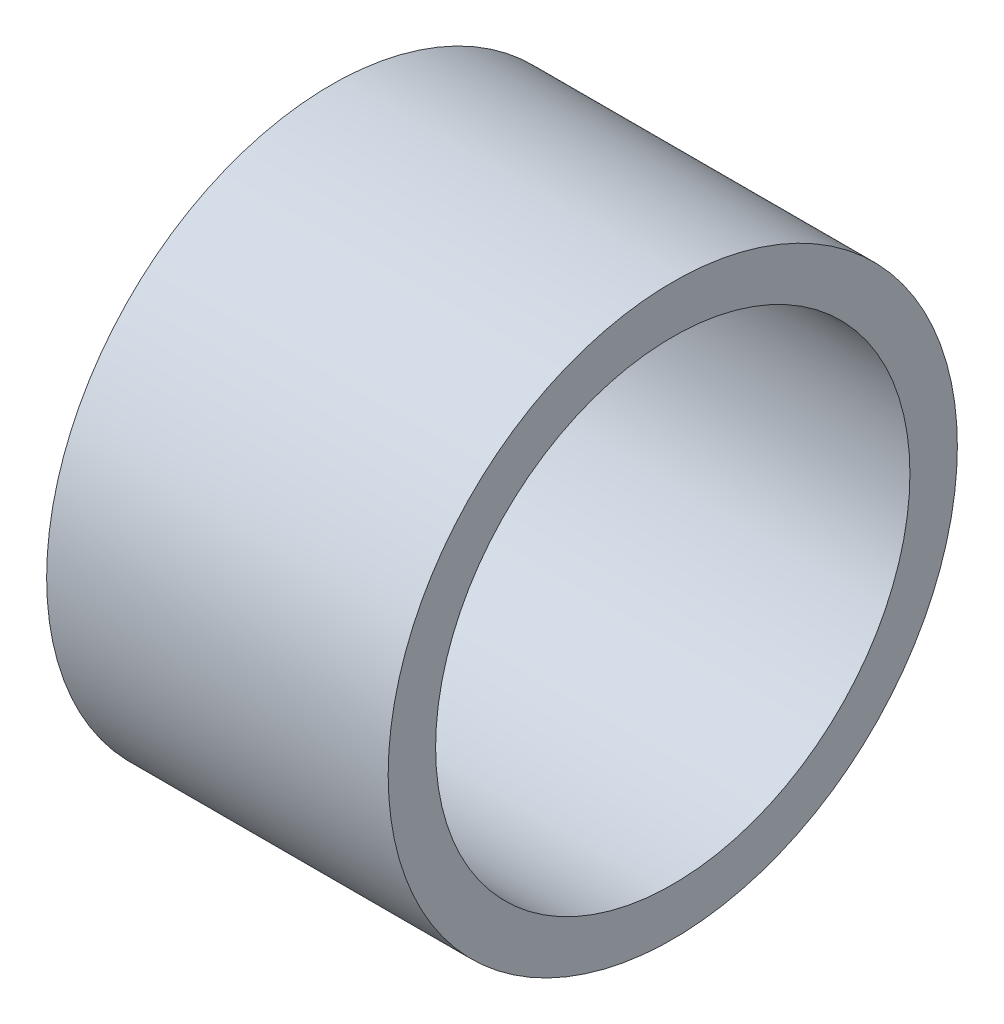
ISO-10303-21;
HEADER;
FILE_DESCRIPTION(('STEP AP214'),'2;1');
FILE_NAME('part.step','',(''),(''),'','','');
FILE_SCHEMA(('AUTOMOTIVE_DESIGN { 1 0 10303 214 1 1 1 1 }'));
ENDSEC;
DATA;
#1=APPLICATION_CONTEXT('core data for automotive mechanical design processes');
#2=APPLICATION_PROTOCOL_DEFINITION('international standard','automotive_design',2000,#1);
#3=PRODUCT_CONTEXT('',#1,'mechanical');
#4=PRODUCT('Part','Part','',(#3));
#5=PRODUCT_RELATED_PRODUCT_CATEGORY('part','',(#4));
#6=PRODUCT_DEFINITION_FORMATION('','',#4);
#7=PRODUCT_DEFINITION_CONTEXT('part definition',#1,'design');
#8=PRODUCT_DEFINITION('design','',#6,#7);
#9=PRODUCT_DEFINITION_SHAPE('','',#8);
#10=(LENGTH_UNIT() NAMED_UNIT(*) SI_UNIT(.MILLI.,.METRE.));
#11=(NAMED_UNIT(*) PLANE_ANGLE_UNIT() SI_UNIT($,.RADIAN.));
#12=(NAMED_UNIT(*) SI_UNIT($,.STERADIAN.) SOLID_ANGLE_UNIT());
#13=UNCERTAINTY_MEASURE_WITH_UNIT(LENGTH_MEASURE(1.E-05),#10,'distance_accuracy_value','');
#14=(GEOMETRIC_REPRESENTATION_CONTEXT(3) GLOBAL_UNCERTAINTY_ASSIGNED_CONTEXT((#13)) GLOBAL_UNIT_ASSIGNED_CONTEXT((#10,
#11,#12)) REPRESENTATION_CONTEXT('',''));
#15=CARTESIAN_POINT('',(0.,0.,0.));
#16=DIRECTION('',(0.,0.,1.));
#17=DIRECTION('',(1.,0.,0.));
#18=AXIS2_PLACEMENT_3D('',#15,#16,#17);
#19=CARTESIAN_POINT('',(11.43,0.,0.));
#20=DIRECTION('',(1.,0.,0.));
#21=DIRECTION('',(0.,0.,-1.));
#22=AXIS2_PLACEMENT_3D('',#19,#20,#21);
#23=PLANE('',#22);
#24=CARTESIAN_POINT('',(11.43,0.,0.));
#25=DIRECTION('',(1.,0.,0.));
#26=DIRECTION('',(0.,0.,-1.));
#27=AXIS2_PLACEMENT_3D('',#24,#25,#26);
#28=CIRCLE('',#27,9.525);
#29=CARTESIAN_POINT('',(11.43,0.,-9.525));
#30=VERTEX_POINT('',#29);
#31=EDGE_CURVE('E10',#30,#30,#28,.T.);
#32=ORIENTED_EDGE('',*,*,#31,.T.);
#33=EDGE_LOOP('',(#32));
#34=FACE_BOUND('',#33,.T.);
#35=CARTESIAN_POINT('',(11.43,0.,0.));
#36=DIRECTION('',(1.,0.,0.));
#37=DIRECTION('',(0.,0.,-1.));
#38=AXIS2_PLACEMENT_3D('',#35,#36,#37);
#39=CIRCLE('',#38,7.9375);
#40=CARTESIAN_POINT('',(11.43,0.,-7.9375));
#41=VERTEX_POINT('',#40);
#42=EDGE_CURVE('E56',#41,#41,#39,.T.);
#43=ORIENTED_EDGE('',*,*,#42,.F.);
#44=EDGE_LOOP('',(#43));
#45=FACE_BOUND('',#44,.T.);
#46=ADVANCED_FACE('F43',(#34,#45),#23,.T.);
#47=CARTESIAN_POINT('',(0.,0.,0.));
#48=DIRECTION('',(1.,0.,0.));
#49=DIRECTION('',(0.,0.,-1.));
#50=AXIS2_PLACEMENT_3D('',#47,#48,#49);
#51=PLANE('',#50);
#52=CARTESIAN_POINT('',(0.,0.,0.));
#53=DIRECTION('',(1.,0.,0.));
#54=DIRECTION('',(0.,0.,-1.));
#55=AXIS2_PLACEMENT_3D('',#52,#53,#54);
#56=CIRCLE('',#55,9.525);
#57=CARTESIAN_POINT('',(0.,0.,-9.525));
#58=VERTEX_POINT('',#57);
#59=EDGE_CURVE('E47',#58,#58,#56,.T.);
#60=ORIENTED_EDGE('',*,*,#59,.F.);
#61=EDGE_LOOP('',(#60));
#62=FACE_BOUND('',#61,.T.);
#63=CARTESIAN_POINT('',(0.,0.,0.));
#64=DIRECTION('',(1.,0.,0.));
#65=DIRECTION('',(0.,0.,-1.));
#66=AXIS2_PLACEMENT_3D('',#63,#64,#65);
#67=CIRCLE('',#66,7.9375);
#68=CARTESIAN_POINT('',(0.,0.,-7.9375));
#69=VERTEX_POINT('',#68);
#70=EDGE_CURVE('E58',#69,#69,#67,.T.);
#71=ORIENTED_EDGE('',*,*,#70,.T.);
#72=EDGE_LOOP('',(#71));
#73=FACE_BOUND('',#72,.T.);
#74=ADVANCED_FACE('F70',(#62,#73),#51,.F.);
#75=CARTESIAN_POINT('',(11.43,0.,0.));
#76=DIRECTION('',(-1.,0.,0.));
#77=DIRECTION('',(0.,0.,1.));
#78=AXIS2_PLACEMENT_3D('',#75,#76,#77);
#79=CYLINDRICAL_SURFACE('',#78,9.525);
#80=ORIENTED_EDGE('',*,*,#31,.F.);
#81=EDGE_LOOP('',(#80));
#82=FACE_BOUND('',#81,.T.);
#83=ORIENTED_EDGE('',*,*,#59,.T.);
#84=EDGE_LOOP('',(#83));
#85=FACE_BOUND('',#84,.T.);
#86=ADVANCED_FACE('F45',(#82,#85),#79,.T.);
#87=CARTESIAN_POINT('',(11.43,0.,0.));
#88=DIRECTION('',(-1.,0.,0.));
#89=DIRECTION('',(0.,0.,1.));
#90=AXIS2_PLACEMENT_3D('',#87,#88,#89);
#91=CYLINDRICAL_SURFACE('',#90,7.9375);
#92=ORIENTED_EDGE('',*,*,#42,.T.);
#93=EDGE_LOOP('',(#92));
#94=FACE_BOUND('',#93,.T.);
#95=ORIENTED_EDGE('',*,*,#70,.F.);
#96=EDGE_LOOP('',(#95));
#97=FACE_BOUND('',#96,.T.);
#98=ADVANCED_FACE('F66',(#94,#97),#91,.F.);
#99=CLOSED_SHELL('',(#46,#74,#86,#98));
#100=MANIFOLD_SOLID_BREP('B2',#99);
#101=ADVANCED_BREP_SHAPE_REPRESENTATION('',(#18,#100),#14);
#102=SHAPE_DEFINITION_REPRESENTATION(#9,#101);
ENDSEC;
END-ISO-10303-21;
